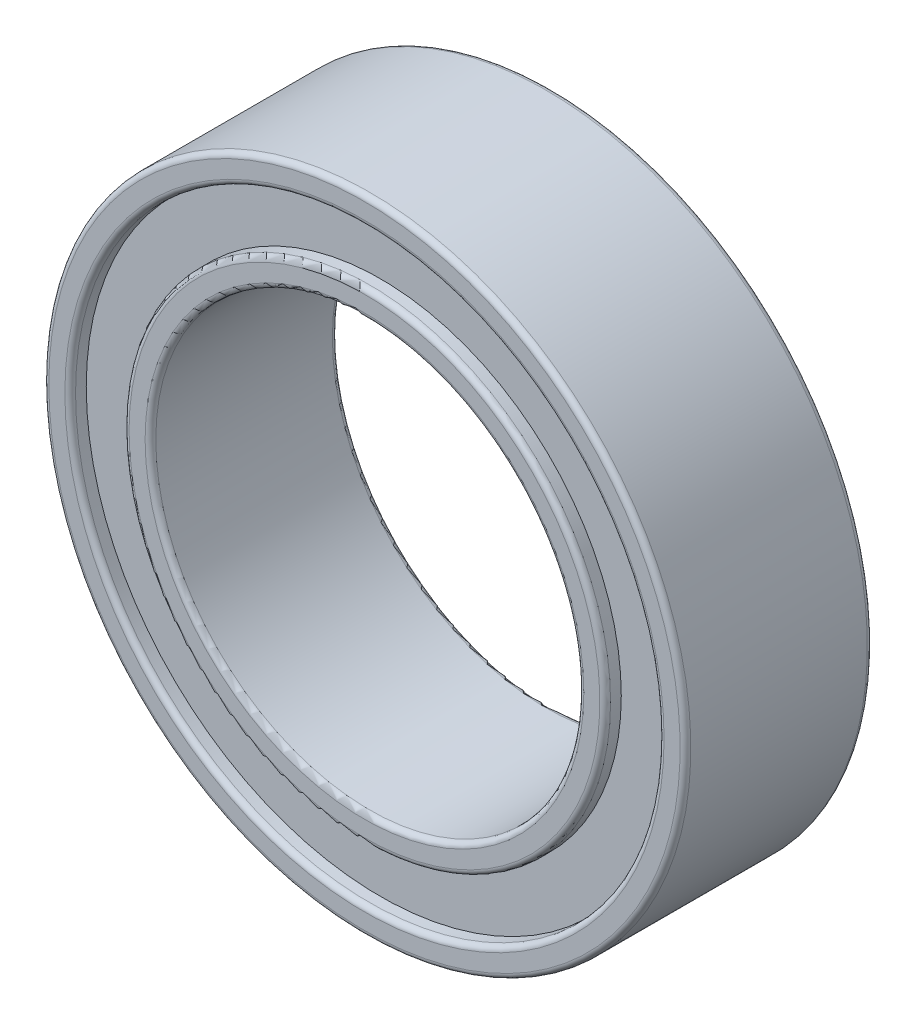
ISO-10303-21;
HEADER;
FILE_DESCRIPTION(('STEP AP214'),'2;1');
FILE_NAME('part.step','',(''),(''),'','','');
FILE_SCHEMA(('AUTOMOTIVE_DESIGN { 1 0 10303 214 1 1 1 1 }'));
ENDSEC;
DATA;
#1=APPLICATION_CONTEXT('core data for automotive mechanical design processes');
#2=APPLICATION_PROTOCOL_DEFINITION('international standard','automotive_design',2000,#1);
#3=PRODUCT_CONTEXT('',#1,'mechanical');
#4=PRODUCT('Part','Part','',(#3));
#5=PRODUCT_RELATED_PRODUCT_CATEGORY('part','',(#4));
#6=PRODUCT_DEFINITION_FORMATION('','',#4);
#7=PRODUCT_DEFINITION_CONTEXT('part definition',#1,'design');
#8=PRODUCT_DEFINITION('design','',#6,#7);
#9=PRODUCT_DEFINITION_SHAPE('','',#8);
#10=(LENGTH_UNIT() NAMED_UNIT(*) SI_UNIT(.MILLI.,.METRE.));
#11=(NAMED_UNIT(*) PLANE_ANGLE_UNIT() SI_UNIT($,.RADIAN.));
#12=(NAMED_UNIT(*) SI_UNIT($,.STERADIAN.) SOLID_ANGLE_UNIT());
#13=UNCERTAINTY_MEASURE_WITH_UNIT(LENGTH_MEASURE(1.E-05),#10,'distance_accuracy_value','');
#14=(GEOMETRIC_REPRESENTATION_CONTEXT(3) GLOBAL_UNCERTAINTY_ASSIGNED_CONTEXT((#13)) GLOBAL_UNIT_ASSIGNED_CONTEXT((#10,
#11,#12)) REPRESENTATION_CONTEXT('',''));
#15=CARTESIAN_POINT('',(0.,0.,0.));
#16=DIRECTION('',(0.,0.,1.));
#17=DIRECTION('',(1.,0.,0.));
#18=AXIS2_PLACEMENT_3D('',#15,#16,#17);
#19=CARTESIAN_POINT('',(0.,0.,1.65));
#20=DIRECTION('',(0.,0.,1.));
#21=DIRECTION('',(-1.,0.,0.));
#22=AXIS2_PLACEMENT_3D('',#19,#20,#21);
#23=TOROIDAL_SURFACE('',#22,4.1,0.1);
#24=CARTESIAN_POINT('',(0.,0.,1.65));
#25=DIRECTION('',(0.,0.,-1.));
#26=DIRECTION('',(-1.,0.,0.));
#27=AXIS2_PLACEMENT_3D('',#24,#25,#26);
#28=CIRCLE('',#27,4.);
#29=CARTESIAN_POINT('',(-4.,0.,1.65));
#30=VERTEX_POINT('',#29);
#31=EDGE_CURVE('E178',#30,#30,#28,.T.);
#32=ORIENTED_EDGE('',*,*,#31,.T.);
#33=EDGE_LOOP('',(#32));
#34=FACE_BOUND('',#33,.T.);
#35=CARTESIAN_POINT('',(0.,0.,1.75));
#36=DIRECTION('',(0.,0.,-1.));
#37=DIRECTION('',(-1.,0.,0.));
#38=AXIS2_PLACEMENT_3D('',#35,#36,#37);
#39=CIRCLE('',#38,4.1);
#40=CARTESIAN_POINT('',(-4.1,0.,1.75));
#41=VERTEX_POINT('',#40);
#42=EDGE_CURVE('E128',#41,#41,#39,.T.);
#43=ORIENTED_EDGE('',*,*,#42,.F.);
#44=EDGE_LOOP('',(#43));
#45=FACE_BOUND('',#44,.T.);
#46=ADVANCED_FACE('F16',(#34,#45),#23,.T.);
#47=CARTESIAN_POINT('',(0.,0.,-1.65));
#48=DIRECTION('',(0.,0.,1.));
#49=DIRECTION('',(-1.,0.,0.));
#50=AXIS2_PLACEMENT_3D('',#47,#48,#49);
#51=TOROIDAL_SURFACE('',#50,4.1,0.1);
#52=CARTESIAN_POINT('',(0.,0.,-1.65));
#53=DIRECTION('',(0.,0.,1.));
#54=DIRECTION('',(-1.,0.,0.));
#55=AXIS2_PLACEMENT_3D('',#52,#53,#54);
#56=CIRCLE('',#55,4.);
#57=CARTESIAN_POINT('',(-4.,0.,-1.65));
#58=VERTEX_POINT('',#57);
#59=EDGE_CURVE('E183',#58,#58,#56,.T.);
#60=ORIENTED_EDGE('',*,*,#59,.T.);
#61=EDGE_LOOP('',(#60));
#62=FACE_BOUND('',#61,.T.);
#63=CARTESIAN_POINT('',(0.,0.,-1.75));
#64=DIRECTION('',(0.,0.,1.));
#65=DIRECTION('',(-1.,0.,0.));
#66=AXIS2_PLACEMENT_3D('',#63,#64,#65);
#67=CIRCLE('',#66,4.1);
#68=CARTESIAN_POINT('',(-4.1,0.,-1.75));
#69=VERTEX_POINT('',#68);
#70=EDGE_CURVE('E219',#69,#69,#67,.T.);
#71=ORIENTED_EDGE('',*,*,#70,.F.);
#72=EDGE_LOOP('',(#71));
#73=FACE_BOUND('',#72,.T.);
#74=ADVANCED_FACE('F260',(#62,#73),#51,.T.);
#75=CARTESIAN_POINT('',(0.,0.,1.65));
#76=DIRECTION('',(0.,0.,1.));
#77=DIRECTION('',(-1.,0.,0.));
#78=AXIS2_PLACEMENT_3D('',#75,#76,#77);
#79=TOROIDAL_SURFACE('',#78,4.4,0.1);
#80=CARTESIAN_POINT('',(0.,0.,1.75));
#81=DIRECTION('',(0.,0.,1.));
#82=DIRECTION('',(-1.,0.,0.));
#83=AXIS2_PLACEMENT_3D('',#80,#81,#82);
#84=CIRCLE('',#83,4.4);
#85=CARTESIAN_POINT('',(-4.4,0.,1.75));
#86=VERTEX_POINT('',#85);
#87=EDGE_CURVE('E196',#86,#86,#84,.T.);
#88=ORIENTED_EDGE('',*,*,#87,.F.);
#89=EDGE_LOOP('',(#88));
#90=FACE_BOUND('',#89,.T.);
#91=CARTESIAN_POINT('',(0.,0.,1.65));
#92=DIRECTION('',(0.,0.,1.));
#93=DIRECTION('',(-1.,0.,0.));
#94=AXIS2_PLACEMENT_3D('',#91,#92,#93);
#95=CIRCLE('',#94,4.5);
#96=CARTESIAN_POINT('',(-4.5,0.,1.65));
#97=VERTEX_POINT('',#96);
#98=EDGE_CURVE('E126',#97,#97,#95,.T.);
#99=ORIENTED_EDGE('',*,*,#98,.T.);
#100=EDGE_LOOP('',(#99));
#101=FACE_BOUND('',#100,.T.);
#102=ADVANCED_FACE('F265',(#90,#101),#79,.T.);
#103=CARTESIAN_POINT('',(0.,0.,-1.65));
#104=DIRECTION('',(0.,0.,1.));
#105=DIRECTION('',(-1.,0.,0.));
#106=AXIS2_PLACEMENT_3D('',#103,#104,#105);
#107=TOROIDAL_SURFACE('',#106,4.4,0.1);
#108=CARTESIAN_POINT('',(0.,0.,-1.75));
#109=DIRECTION('',(0.,0.,-1.));
#110=DIRECTION('',(-1.,0.,0.));
#111=AXIS2_PLACEMENT_3D('',#108,#109,#110);
#112=CIRCLE('',#111,4.4);
#113=CARTESIAN_POINT('',(-4.4,0.,-1.75));
#114=VERTEX_POINT('',#113);
#115=EDGE_CURVE('E215',#114,#114,#112,.T.);
#116=ORIENTED_EDGE('',*,*,#115,.F.);
#117=EDGE_LOOP('',(#116));
#118=FACE_BOUND('',#117,.T.);
#119=CARTESIAN_POINT('',(0.,0.,-1.65));
#120=DIRECTION('',(0.,0.,-1.));
#121=DIRECTION('',(-1.,0.,0.));
#122=AXIS2_PLACEMENT_3D('',#119,#120,#121);
#123=CIRCLE('',#122,4.5);
#124=CARTESIAN_POINT('',(-4.5,0.,-1.65));
#125=VERTEX_POINT('',#124);
#126=EDGE_CURVE('E170',#125,#125,#123,.T.);
#127=ORIENTED_EDGE('',*,*,#126,.T.);
#128=EDGE_LOOP('',(#127));
#129=FACE_BOUND('',#128,.T.);
#130=ADVANCED_FACE('F280',(#118,#129),#107,.T.);
#131=CARTESIAN_POINT('',(0.,0.,1.65));
#132=DIRECTION('',(0.,0.,1.));
#133=DIRECTION('',(-1.,0.,0.));
#134=AXIS2_PLACEMENT_3D('',#131,#132,#133);
#135=TOROIDAL_SURFACE('',#134,5.6,0.1);
#136=CARTESIAN_POINT('',(0.,0.,1.65));
#137=DIRECTION('',(0.,0.,-1.));
#138=DIRECTION('',(-1.,0.,0.));
#139=AXIS2_PLACEMENT_3D('',#136,#137,#138);
#140=CIRCLE('',#139,5.5);
#141=CARTESIAN_POINT('',(-5.5,0.,1.65));
#142=VERTEX_POINT('',#141);
#143=EDGE_CURVE('E10',#142,#142,#140,.T.);
#144=ORIENTED_EDGE('',*,*,#143,.T.);
#145=EDGE_LOOP('',(#144));
#146=FACE_BOUND('',#145,.T.);
#147=CARTESIAN_POINT('',(0.,0.,1.75));
#148=DIRECTION('',(0.,0.,-1.));
#149=DIRECTION('',(-1.,0.,0.));
#150=AXIS2_PLACEMENT_3D('',#147,#148,#149);
#151=CIRCLE('',#150,5.6);
#152=CARTESIAN_POINT('',(-5.6,0.,1.75));
#153=VERTEX_POINT('',#152);
#154=EDGE_CURVE('E113',#153,#153,#151,.T.);
#155=ORIENTED_EDGE('',*,*,#154,.F.);
#156=EDGE_LOOP('',(#155));
#157=FACE_BOUND('',#156,.T.);
#158=ADVANCED_FACE('F310',(#146,#157),#135,.T.);
#159=CARTESIAN_POINT('',(0.,0.,-1.65));
#160=DIRECTION('',(0.,0.,1.));
#161=DIRECTION('',(-1.,0.,0.));
#162=AXIS2_PLACEMENT_3D('',#159,#160,#161);
#163=TOROIDAL_SURFACE('',#162,5.6,0.1);
#164=CARTESIAN_POINT('',(0.,0.,-1.65));
#165=DIRECTION('',(0.,0.,1.));
#166=DIRECTION('',(-1.,0.,0.));
#167=AXIS2_PLACEMENT_3D('',#164,#165,#166);
#168=CIRCLE('',#167,5.5);
#169=CARTESIAN_POINT('',(-5.5,0.,-1.65));
#170=VERTEX_POINT('',#169);
#171=EDGE_CURVE('E160',#170,#170,#168,.T.);
#172=ORIENTED_EDGE('',*,*,#171,.T.);
#173=EDGE_LOOP('',(#172));
#174=FACE_BOUND('',#173,.T.);
#175=CARTESIAN_POINT('',(0.,0.,-1.75));
#176=DIRECTION('',(0.,0.,1.));
#177=DIRECTION('',(-1.,0.,0.));
#178=AXIS2_PLACEMENT_3D('',#175,#176,#177);
#179=CIRCLE('',#178,5.6);
#180=CARTESIAN_POINT('',(-5.6,0.,-1.75));
#181=VERTEX_POINT('',#180);
#182=EDGE_CURVE('E156',#181,#181,#179,.T.);
#183=ORIENTED_EDGE('',*,*,#182,.F.);
#184=EDGE_LOOP('',(#183));
#185=FACE_BOUND('',#184,.T.);
#186=ADVANCED_FACE('F307',(#174,#185),#163,.T.);
#187=CARTESIAN_POINT('',(0.,0.,1.65));
#188=DIRECTION('',(0.,0.,1.));
#189=DIRECTION('',(-1.,0.,0.));
#190=AXIS2_PLACEMENT_3D('',#187,#188,#189);
#191=TOROIDAL_SURFACE('',#190,5.9,0.1);
#192=CARTESIAN_POINT('',(0.,0.,1.75));
#193=DIRECTION('',(0.,0.,1.));
#194=DIRECTION('',(-1.,0.,0.));
#195=AXIS2_PLACEMENT_3D('',#192,#193,#194);
#196=CIRCLE('',#195,5.9);
#197=CARTESIAN_POINT('',(-5.9,0.,1.75));
#198=VERTEX_POINT('',#197);
#199=EDGE_CURVE('E119',#198,#198,#196,.T.);
#200=ORIENTED_EDGE('',*,*,#199,.F.);
#201=EDGE_LOOP('',(#200));
#202=FACE_BOUND('',#201,.T.);
#203=CARTESIAN_POINT('',(0.,0.,1.65));
#204=DIRECTION('',(0.,0.,1.));
#205=DIRECTION('',(-1.,0.,0.));
#206=AXIS2_PLACEMENT_3D('',#203,#204,#205);
#207=CIRCLE('',#206,6.);
#208=CARTESIAN_POINT('',(-6.,0.,1.65));
#209=VERTEX_POINT('',#208);
#210=EDGE_CURVE('E190',#209,#209,#207,.T.);
#211=ORIENTED_EDGE('',*,*,#210,.T.);
#212=EDGE_LOOP('',(#211));
#213=FACE_BOUND('',#212,.T.);
#214=ADVANCED_FACE('F300',(#202,#213),#191,.T.);
#215=CARTESIAN_POINT('',(0.,0.,-1.65));
#216=DIRECTION('',(0.,0.,1.));
#217=DIRECTION('',(-1.,0.,0.));
#218=AXIS2_PLACEMENT_3D('',#215,#216,#217);
#219=TOROIDAL_SURFACE('',#218,5.9,0.1);
#220=CARTESIAN_POINT('',(0.,0.,-1.75));
#221=DIRECTION('',(0.,0.,1.));
#222=DIRECTION('',(-1.,0.,0.));
#223=AXIS2_PLACEMENT_3D('',#220,#221,#222);
#224=CIRCLE('',#223,5.9);
#225=CARTESIAN_POINT('',(-5.9,0.,-1.75));
#226=VERTEX_POINT('',#225);
#227=EDGE_CURVE('E152',#226,#226,#224,.T.);
#228=ORIENTED_EDGE('',*,*,#227,.T.);
#229=EDGE_LOOP('',(#228));
#230=FACE_BOUND('',#229,.T.);
#231=CARTESIAN_POINT('',(0.,0.,-1.65));
#232=DIRECTION('',(0.,0.,1.));
#233=DIRECTION('',(-1.,0.,0.));
#234=AXIS2_PLACEMENT_3D('',#231,#232,#233);
#235=CIRCLE('',#234,6.);
#236=CARTESIAN_POINT('',(-6.,0.,-1.65));
#237=VERTEX_POINT('',#236);
#238=EDGE_CURVE('E182',#237,#237,#235,.T.);
#239=ORIENTED_EDGE('',*,*,#238,.F.);
#240=EDGE_LOOP('',(#239));
#241=FACE_BOUND('',#240,.T.);
#242=ADVANCED_FACE('F239',(#230,#241),#219,.T.);
#243=CARTESIAN_POINT('',(0.,0.,1.45));
#244=DIRECTION('',(0.,0.,1.));
#245=DIRECTION('',(1.,0.,0.));
#246=AXIS2_PLACEMENT_3D('',#243,#244,#245);
#247=PLANE('',#246);
#248=CARTESIAN_POINT('',(0.,0.,1.45));
#249=DIRECTION('',(0.,0.,1.));
#250=DIRECTION('',(-1.,0.,0.));
#251=AXIS2_PLACEMENT_3D('',#248,#249,#250);
#252=CIRCLE('',#251,4.5);
#253=CARTESIAN_POINT('',(-4.5,0.,1.45));
#254=VERTEX_POINT('',#253);
#255=EDGE_CURVE('E118',#254,#254,#252,.T.);
#256=ORIENTED_EDGE('',*,*,#255,.F.);
#257=EDGE_LOOP('',(#256));
#258=FACE_BOUND('',#257,.T.);
#259=CARTESIAN_POINT('',(0.,0.,1.45));
#260=DIRECTION('',(0.,0.,1.));
#261=DIRECTION('',(-1.,0.,0.));
#262=AXIS2_PLACEMENT_3D('',#259,#260,#261);
#263=CIRCLE('',#262,5.5);
#264=CARTESIAN_POINT('',(-5.5,0.,1.45));
#265=VERTEX_POINT('',#264);
#266=EDGE_CURVE('E24',#265,#265,#263,.T.);
#267=ORIENTED_EDGE('',*,*,#266,.T.);
#268=EDGE_LOOP('',(#267));
#269=FACE_BOUND('',#268,.T.);
#270=ADVANCED_FACE('F291',(#258,#269),#247,.T.);
#271=CARTESIAN_POINT('',(0.,0.,1.45));
#272=DIRECTION('',(0.,0.,1.));
#273=DIRECTION('',(-1.,0.,0.));
#274=AXIS2_PLACEMENT_3D('',#271,#272,#273);
#275=CYLINDRICAL_SURFACE('',#274,5.5);
#276=ORIENTED_EDGE('',*,*,#143,.F.);
#277=EDGE_LOOP('',(#276));
#278=FACE_BOUND('',#277,.T.);
#279=ORIENTED_EDGE('',*,*,#266,.F.);
#280=EDGE_LOOP('',(#279));
#281=FACE_BOUND('',#280,.T.);
#282=ADVANCED_FACE('F287',(#278,#281),#275,.F.);
#283=CARTESIAN_POINT('',(0.,0.,1.45));
#284=DIRECTION('',(0.,0.,1.));
#285=DIRECTION('',(-1.,0.,0.));
#286=AXIS2_PLACEMENT_3D('',#283,#284,#285);
#287=CYLINDRICAL_SURFACE('',#286,4.5);
#288=ORIENTED_EDGE('',*,*,#98,.F.);
#289=EDGE_LOOP('',(#288));
#290=FACE_BOUND('',#289,.T.);
#291=ORIENTED_EDGE('',*,*,#255,.T.);
#292=EDGE_LOOP('',(#291));
#293=FACE_BOUND('',#292,.T.);
#294=ADVANCED_FACE('F284',(#290,#293),#287,.T.);
#295=CARTESIAN_POINT('',(0.,0.,1.75));
#296=DIRECTION('',(0.,0.,1.));
#297=DIRECTION('',(1.,0.,0.));
#298=AXIS2_PLACEMENT_3D('',#295,#296,#297);
#299=PLANE('',#298);
#300=ORIENTED_EDGE('',*,*,#154,.T.);
#301=EDGE_LOOP('',(#300));
#302=FACE_BOUND('',#301,.T.);
#303=ORIENTED_EDGE('',*,*,#199,.T.);
#304=EDGE_LOOP('',(#303));
#305=FACE_BOUND('',#304,.T.);
#306=ADVANCED_FACE('F114',(#302,#305),#299,.T.);
#307=CARTESIAN_POINT('',(0.,0.,1.75));
#308=DIRECTION('',(0.,0.,1.));
#309=DIRECTION('',(1.,0.,0.));
#310=AXIS2_PLACEMENT_3D('',#307,#308,#309);
#311=PLANE('',#310);
#312=ORIENTED_EDGE('',*,*,#42,.T.);
#313=EDGE_LOOP('',(#312));
#314=FACE_BOUND('',#313,.T.);
#315=ORIENTED_EDGE('',*,*,#87,.T.);
#316=EDGE_LOOP('',(#315));
#317=FACE_BOUND('',#316,.T.);
#318=ADVANCED_FACE('F271',(#314,#317),#311,.T.);
#319=CARTESIAN_POINT('',(0.,0.,-1.45));
#320=DIRECTION('',(0.,0.,1.));
#321=DIRECTION('',(1.,0.,0.));
#322=AXIS2_PLACEMENT_3D('',#319,#320,#321);
#323=PLANE('',#322);
#324=CARTESIAN_POINT('',(0.,0.,-1.45));
#325=DIRECTION('',(0.,0.,1.));
#326=DIRECTION('',(-1.,0.,0.));
#327=AXIS2_PLACEMENT_3D('',#324,#325,#326);
#328=CIRCLE('',#327,4.5);
#329=CARTESIAN_POINT('',(-4.5,0.,-1.45));
#330=VERTEX_POINT('',#329);
#331=EDGE_CURVE('E174',#330,#330,#328,.T.);
#332=ORIENTED_EDGE('',*,*,#331,.T.);
#333=EDGE_LOOP('',(#332));
#334=FACE_BOUND('',#333,.T.);
#335=CARTESIAN_POINT('',(0.,0.,-1.45));
#336=DIRECTION('',(0.,0.,1.));
#337=DIRECTION('',(-1.,0.,0.));
#338=AXIS2_PLACEMENT_3D('',#335,#336,#337);
#339=CIRCLE('',#338,5.5);
#340=CARTESIAN_POINT('',(-5.5,0.,-1.45));
#341=VERTEX_POINT('',#340);
#342=EDGE_CURVE('E166',#341,#341,#339,.T.);
#343=ORIENTED_EDGE('',*,*,#342,.F.);
#344=EDGE_LOOP('',(#343));
#345=FACE_BOUND('',#344,.T.);
#346=ADVANCED_FACE('F274',(#334,#345),#323,.F.);
#347=CARTESIAN_POINT('',(0.,0.,-1.75));
#348=DIRECTION('',(0.,0.,1.));
#349=DIRECTION('',(-1.,0.,0.));
#350=AXIS2_PLACEMENT_3D('',#347,#348,#349);
#351=CYLINDRICAL_SURFACE('',#350,6.);
#352=ORIENTED_EDGE('',*,*,#210,.F.);
#353=EDGE_LOOP('',(#352));
#354=FACE_BOUND('',#353,.T.);
#355=ORIENTED_EDGE('',*,*,#238,.T.);
#356=EDGE_LOOP('',(#355));
#357=FACE_BOUND('',#356,.T.);
#358=ADVANCED_FACE('F326',(#354,#357),#351,.T.);
#359=CARTESIAN_POINT('',(0.,0.,-1.75));
#360=DIRECTION('',(0.,0.,1.));
#361=DIRECTION('',(-1.,0.,0.));
#362=AXIS2_PLACEMENT_3D('',#359,#360,#361);
#363=CYLINDRICAL_SURFACE('',#362,4.);
#364=ORIENTED_EDGE('',*,*,#31,.F.);
#365=EDGE_LOOP('',(#364));
#366=FACE_BOUND('',#365,.T.);
#367=ORIENTED_EDGE('',*,*,#59,.F.);
#368=EDGE_LOOP('',(#367));
#369=FACE_BOUND('',#368,.T.);
#370=ADVANCED_FACE('F321',(#366,#369),#363,.F.);
#371=CARTESIAN_POINT('',(0.,0.,-1.45));
#372=DIRECTION('',(0.,0.,1.));
#373=DIRECTION('',(-1.,0.,0.));
#374=AXIS2_PLACEMENT_3D('',#371,#372,#373);
#375=CYLINDRICAL_SURFACE('',#374,4.5);
#376=ORIENTED_EDGE('',*,*,#331,.F.);
#377=EDGE_LOOP('',(#376));
#378=FACE_BOUND('',#377,.T.);
#379=ORIENTED_EDGE('',*,*,#126,.F.);
#380=EDGE_LOOP('',(#379));
#381=FACE_BOUND('',#380,.T.);
#382=ADVANCED_FACE('F255',(#378,#381),#375,.T.);
#383=CARTESIAN_POINT('',(0.,0.,-1.45));
#384=DIRECTION('',(0.,0.,1.));
#385=DIRECTION('',(-1.,0.,0.));
#386=AXIS2_PLACEMENT_3D('',#383,#384,#385);
#387=CYLINDRICAL_SURFACE('',#386,5.5);
#388=ORIENTED_EDGE('',*,*,#342,.T.);
#389=EDGE_LOOP('',(#388));
#390=FACE_BOUND('',#389,.T.);
#391=ORIENTED_EDGE('',*,*,#171,.F.);
#392=EDGE_LOOP('',(#391));
#393=FACE_BOUND('',#392,.T.);
#394=ADVANCED_FACE('F245',(#390,#393),#387,.F.);
#395=CARTESIAN_POINT('',(0.,0.,-1.75));
#396=DIRECTION('',(0.,0.,1.));
#397=DIRECTION('',(1.,0.,0.));
#398=AXIS2_PLACEMENT_3D('',#395,#396,#397);
#399=PLANE('',#398);
#400=ORIENTED_EDGE('',*,*,#182,.T.);
#401=EDGE_LOOP('',(#400));
#402=FACE_BOUND('',#401,.T.);
#403=ORIENTED_EDGE('',*,*,#227,.F.);
#404=EDGE_LOOP('',(#403));
#405=FACE_BOUND('',#404,.T.);
#406=ADVANCED_FACE('F242',(#402,#405),#399,.F.);
#407=CARTESIAN_POINT('',(0.,0.,-1.75));
#408=DIRECTION('',(0.,0.,1.));
#409=DIRECTION('',(1.,0.,0.));
#410=AXIS2_PLACEMENT_3D('',#407,#408,#409);
#411=PLANE('',#410);
#412=ORIENTED_EDGE('',*,*,#70,.T.);
#413=EDGE_LOOP('',(#412));
#414=FACE_BOUND('',#413,.T.);
#415=ORIENTED_EDGE('',*,*,#115,.T.);
#416=EDGE_LOOP('',(#415));
#417=FACE_BOUND('',#416,.T.);
#418=ADVANCED_FACE('F244',(#414,#417),#411,.F.);
#419=CLOSED_SHELL('',(#46,#74,#102,#130,#158,#186,#214,#242,#270,#282,#294,#306,#318,#346,#358,
#370,#382,#394,#406,#418));
#420=MANIFOLD_SOLID_BREP('B1',#419);
#421=ADVANCED_BREP_SHAPE_REPRESENTATION('',(#18,#420),#14);
#422=SHAPE_DEFINITION_REPRESENTATION(#9,#421);
ENDSEC;
END-ISO-10303-21;
